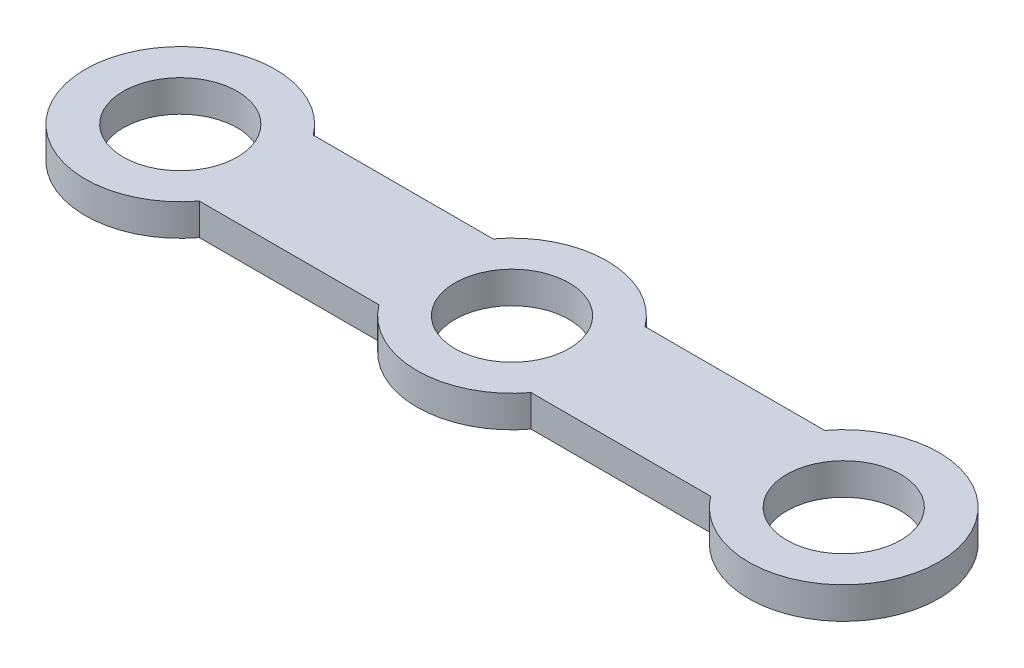
ISO-10303-21;
HEADER;
FILE_DESCRIPTION(('STEP AP214'),'2;1');
FILE_NAME('part.step','',(''),(''),'','','');
FILE_SCHEMA(('AUTOMOTIVE_DESIGN { 1 0 10303 214 1 1 1 1 }'));
ENDSEC;
DATA;
#1=APPLICATION_CONTEXT('core data for automotive mechanical design processes');
#2=APPLICATION_PROTOCOL_DEFINITION('international standard','automotive_design',2000,#1);
#3=PRODUCT_CONTEXT('',#1,'mechanical');
#4=PRODUCT('Part','Part','',(#3));
#5=PRODUCT_RELATED_PRODUCT_CATEGORY('part','',(#4));
#6=PRODUCT_DEFINITION_FORMATION('','',#4);
#7=PRODUCT_DEFINITION_CONTEXT('part definition',#1,'design');
#8=PRODUCT_DEFINITION('design','',#6,#7);
#9=PRODUCT_DEFINITION_SHAPE('','',#8);
#10=(LENGTH_UNIT() NAMED_UNIT(*) SI_UNIT(.MILLI.,.METRE.));
#11=(NAMED_UNIT(*) PLANE_ANGLE_UNIT() SI_UNIT($,.RADIAN.));
#12=(NAMED_UNIT(*) SI_UNIT($,.STERADIAN.) SOLID_ANGLE_UNIT());
#13=UNCERTAINTY_MEASURE_WITH_UNIT(LENGTH_MEASURE(1.E-05),#10,'distance_accuracy_value','');
#14=(GEOMETRIC_REPRESENTATION_CONTEXT(3) GLOBAL_UNCERTAINTY_ASSIGNED_CONTEXT((#13)) GLOBAL_UNIT_ASSIGNED_CONTEXT((#10,
#11,#12)) REPRESENTATION_CONTEXT('',''));
#15=CARTESIAN_POINT('',(0.,0.,0.));
#16=DIRECTION('',(0.,0.,1.));
#17=DIRECTION('',(1.,0.,0.));
#18=AXIS2_PLACEMENT_3D('',#15,#16,#17);
#19=CARTESIAN_POINT('',(1047.091,50.,-1.923474962349E-13));
#20=DIRECTION('',(0.,-1.,0.));
#21=DIRECTION('',(0.,0.,-1.));
#22=AXIS2_PLACEMENT_3D('',#19,#20,#21);
#23=CYLINDRICAL_SURFACE('',#22,150.);
#24=CARTESIAN_POINT('',(1047.091,0.,-1.923474962349E-13));
#25=DIRECTION('',(0.,1.,0.));
#26=DIRECTION('',(0.,0.,1.));
#27=AXIS2_PLACEMENT_3D('',#24,#25,#26);
#28=CIRCLE('',#27,150.);
#29=CARTESIAN_POINT('',(927.091,0.,89.9999999999998));
#30=VERTEX_POINT('',#29);
#31=CARTESIAN_POINT('',(927.091,0.,-90.0000000000002));
#32=VERTEX_POINT('',#31);
#33=EDGE_CURVE('E145',#30,#32,#28,.T.);
#34=ORIENTED_EDGE('',*,*,#33,.T.);
#35=DIRECTION('',(0.,-1.,0.));
#36=VECTOR('',#35,1.);
#37=CARTESIAN_POINT('',(927.091,50.,-90.0000000000002));
#38=LINE('',#37,#36);
#39=CARTESIAN_POINT('',(927.091,50.,-90.0000000000002));
#40=VERTEX_POINT('',#39);
#41=EDGE_CURVE('E11',#40,#32,#38,.T.);
#42=ORIENTED_EDGE('',*,*,#41,.F.);
#43=CARTESIAN_POINT('',(1047.091,50.,-1.923474962349E-13));
#44=DIRECTION('',(0.,1.,0.));
#45=DIRECTION('',(0.,0.,1.));
#46=AXIS2_PLACEMENT_3D('',#43,#44,#45);
#47=CIRCLE('',#46,150.);
#48=CARTESIAN_POINT('',(927.091,50.,89.9999999999998));
#49=VERTEX_POINT('',#48);
#50=EDGE_CURVE('E95',#49,#40,#47,.T.);
#51=ORIENTED_EDGE('',*,*,#50,.F.);
#52=DIRECTION('',(0.,-1.,0.));
#53=VECTOR('',#52,1.);
#54=CARTESIAN_POINT('',(927.091,50.,89.9999999999998));
#55=LINE('',#54,#53);
#56=EDGE_CURVE('E144',#49,#30,#55,.T.);
#57=ORIENTED_EDGE('',*,*,#56,.T.);
#58=EDGE_LOOP('',(#34,#42,#51,#57));
#59=FACE_BOUND('',#58,.T.);
#60=ADVANCED_FACE('F39',(#59),#23,.T.);
#61=CARTESIAN_POINT('',(0.,50.,-90.));
#62=DIRECTION('',(0.,0.,-1.));
#63=DIRECTION('',(-1.,0.,0.));
#64=AXIS2_PLACEMENT_3D('',#61,#62,#63);
#65=PLANE('',#64);
#66=DIRECTION('',(1.,0.,0.));
#67=VECTOR('',#66,1.);
#68=CARTESIAN_POINT('',(0.,0.,-90.));
#69=LINE('',#68,#67);
#70=CARTESIAN_POINT('',(643.5455,0.,-90.0000000000001));
#71=VERTEX_POINT('',#70);
#72=EDGE_CURVE('E148',#71,#32,#69,.T.);
#73=ORIENTED_EDGE('',*,*,#72,.F.);
#74=DIRECTION('',(0.,-1.,0.));
#75=VECTOR('',#74,1.);
#76=CARTESIAN_POINT('',(643.5455,50.,-90.0000000000001));
#77=LINE('',#76,#75);
#78=CARTESIAN_POINT('',(643.5455,50.,-90.0000000000001));
#79=VERTEX_POINT('',#78);
#80=EDGE_CURVE('E47',#79,#71,#77,.T.);
#81=ORIENTED_EDGE('',*,*,#80,.F.);
#82=DIRECTION('',(1.,0.,0.));
#83=VECTOR('',#82,1.);
#84=CARTESIAN_POINT('',(0.,50.,-90.));
#85=LINE('',#84,#83);
#86=EDGE_CURVE('E193',#79,#40,#85,.T.);
#87=ORIENTED_EDGE('',*,*,#86,.T.);
#88=ORIENTED_EDGE('',*,*,#41,.T.);
#89=EDGE_LOOP('',(#73,#81,#87,#88));
#90=FACE_BOUND('',#89,.T.);
#91=ADVANCED_FACE('F192',(#90),#65,.T.);
#92=CARTESIAN_POINT('',(523.5455,50.,0.));
#93=DIRECTION('',(0.,-1.,0.));
#94=DIRECTION('',(0.,0.,-1.));
#95=AXIS2_PLACEMENT_3D('',#92,#93,#94);
#96=CYLINDRICAL_SURFACE('',#95,150.);
#97=CARTESIAN_POINT('',(523.5455,0.,0.));
#98=DIRECTION('',(0.,1.,0.));
#99=DIRECTION('',(0.,0.,1.));
#100=AXIS2_PLACEMENT_3D('',#97,#98,#99);
#101=CIRCLE('',#100,150.);
#102=CARTESIAN_POINT('',(403.5455,0.,-90.));
#103=VERTEX_POINT('',#102);
#104=EDGE_CURVE('E151',#71,#103,#101,.T.);
#105=ORIENTED_EDGE('',*,*,#104,.T.);
#106=DIRECTION('',(0.,-1.,0.));
#107=VECTOR('',#106,1.);
#108=CARTESIAN_POINT('',(403.5455,50.,-90.));
#109=LINE('',#108,#107);
#110=CARTESIAN_POINT('',(403.5455,50.,-90.));
#111=VERTEX_POINT('',#110);
#112=EDGE_CURVE('E176',#111,#103,#109,.T.);
#113=ORIENTED_EDGE('',*,*,#112,.F.);
#114=CARTESIAN_POINT('',(523.5455,50.,0.));
#115=DIRECTION('',(0.,1.,0.));
#116=DIRECTION('',(0.,0.,1.));
#117=AXIS2_PLACEMENT_3D('',#114,#115,#116);
#118=CIRCLE('',#117,150.);
#119=EDGE_CURVE('E182',#79,#111,#118,.T.);
#120=ORIENTED_EDGE('',*,*,#119,.F.);
#121=ORIENTED_EDGE('',*,*,#80,.T.);
#122=EDGE_LOOP('',(#105,#113,#120,#121));
#123=FACE_BOUND('',#122,.T.);
#124=ADVANCED_FACE('F180',(#123),#96,.T.);
#125=CARTESIAN_POINT('',(0.,50.,-90.));
#126=DIRECTION('',(0.,0.,-1.));
#127=DIRECTION('',(-1.,0.,0.));
#128=AXIS2_PLACEMENT_3D('',#125,#126,#127);
#129=PLANE('',#128);
#130=DIRECTION('',(1.,0.,0.));
#131=VECTOR('',#130,1.);
#132=CARTESIAN_POINT('',(0.,0.,-90.));
#133=LINE('',#132,#131);
#134=CARTESIAN_POINT('',(120.,0.,-90.));
#135=VERTEX_POINT('',#134);
#136=EDGE_CURVE('E154',#135,#103,#133,.T.);
#137=ORIENTED_EDGE('',*,*,#136,.F.);
#138=DIRECTION('',(0.,-1.,0.));
#139=VECTOR('',#138,1.);
#140=CARTESIAN_POINT('',(120.,50.,-90.));
#141=LINE('',#140,#139);
#142=CARTESIAN_POINT('',(120.,50.,-90.));
#143=VERTEX_POINT('',#142);
#144=EDGE_CURVE('E174',#143,#135,#141,.T.);
#145=ORIENTED_EDGE('',*,*,#144,.F.);
#146=DIRECTION('',(1.,0.,0.));
#147=VECTOR('',#146,1.);
#148=CARTESIAN_POINT('',(0.,50.,-90.));
#149=LINE('',#148,#147);
#150=EDGE_CURVE('E199',#143,#111,#149,.T.);
#151=ORIENTED_EDGE('',*,*,#150,.T.);
#152=ORIENTED_EDGE('',*,*,#112,.T.);
#153=EDGE_LOOP('',(#137,#145,#151,#152));
#154=FACE_BOUND('',#153,.T.);
#155=ADVANCED_FACE('F197',(#154),#129,.T.);
#156=CARTESIAN_POINT('',(0.,50.,0.));
#157=DIRECTION('',(0.,-1.,0.));
#158=DIRECTION('',(0.,0.,-1.));
#159=AXIS2_PLACEMENT_3D('',#156,#157,#158);
#160=CYLINDRICAL_SURFACE('',#159,150.);
#161=CARTESIAN_POINT('',(0.,0.,0.));
#162=DIRECTION('',(0.,1.,0.));
#163=DIRECTION('',(0.,0.,1.));
#164=AXIS2_PLACEMENT_3D('',#161,#162,#163);
#165=CIRCLE('',#164,150.);
#166=CARTESIAN_POINT('',(120.,0.,90.));
#167=VERTEX_POINT('',#166);
#168=EDGE_CURVE('E157',#135,#167,#165,.T.);
#169=ORIENTED_EDGE('',*,*,#168,.T.);
#170=DIRECTION('',(0.,-1.,0.));
#171=VECTOR('',#170,1.);
#172=CARTESIAN_POINT('',(120.,50.,90.));
#173=LINE('',#172,#171);
#174=CARTESIAN_POINT('',(120.,50.,90.));
#175=VERTEX_POINT('',#174);
#176=EDGE_CURVE('E127',#175,#167,#173,.T.);
#177=ORIENTED_EDGE('',*,*,#176,.F.);
#178=CARTESIAN_POINT('',(0.,50.,0.));
#179=DIRECTION('',(0.,1.,0.));
#180=DIRECTION('',(0.,0.,1.));
#181=AXIS2_PLACEMENT_3D('',#178,#179,#180);
#182=CIRCLE('',#181,150.);
#183=EDGE_CURVE('E118',#143,#175,#182,.T.);
#184=ORIENTED_EDGE('',*,*,#183,.F.);
#185=ORIENTED_EDGE('',*,*,#144,.T.);
#186=EDGE_LOOP('',(#169,#177,#184,#185));
#187=FACE_BOUND('',#186,.T.);
#188=ADVANCED_FACE('F204',(#187),#160,.T.);
#189=CARTESIAN_POINT('',(0.,50.,90.));
#190=DIRECTION('',(0.,0.,-1.));
#191=DIRECTION('',(-1.,0.,0.));
#192=AXIS2_PLACEMENT_3D('',#189,#190,#191);
#193=PLANE('',#192);
#194=DIRECTION('',(1.,0.,0.));
#195=VECTOR('',#194,1.);
#196=CARTESIAN_POINT('',(0.,0.,90.));
#197=LINE('',#196,#195);
#198=CARTESIAN_POINT('',(403.5455,0.,90.));
#199=VERTEX_POINT('',#198);
#200=EDGE_CURVE('E126',#167,#199,#197,.T.);
#201=ORIENTED_EDGE('',*,*,#200,.T.);
#202=DIRECTION('',(0.,-1.,0.));
#203=VECTOR('',#202,1.);
#204=CARTESIAN_POINT('',(403.5455,50.,90.));
#205=LINE('',#204,#203);
#206=CARTESIAN_POINT('',(403.5455,50.,90.));
#207=VERTEX_POINT('',#206);
#208=EDGE_CURVE('E123',#207,#199,#205,.T.);
#209=ORIENTED_EDGE('',*,*,#208,.F.);
#210=DIRECTION('',(1.,0.,0.));
#211=VECTOR('',#210,1.);
#212=CARTESIAN_POINT('',(0.,50.,90.));
#213=LINE('',#212,#211);
#214=EDGE_CURVE('E110',#175,#207,#213,.T.);
#215=ORIENTED_EDGE('',*,*,#214,.F.);
#216=ORIENTED_EDGE('',*,*,#176,.T.);
#217=EDGE_LOOP('',(#201,#209,#215,#216));
#218=FACE_BOUND('',#217,.T.);
#219=ADVANCED_FACE('F124',(#218),#193,.F.);
#220=CARTESIAN_POINT('',(523.5455,50.,0.));
#221=DIRECTION('',(0.,-1.,0.));
#222=DIRECTION('',(0.,0.,-1.));
#223=AXIS2_PLACEMENT_3D('',#220,#221,#222);
#224=CYLINDRICAL_SURFACE('',#223,150.);
#225=CARTESIAN_POINT('',(523.5455,0.,0.));
#226=DIRECTION('',(0.,1.,0.));
#227=DIRECTION('',(0.,0.,1.));
#228=AXIS2_PLACEMENT_3D('',#225,#226,#227);
#229=CIRCLE('',#228,150.);
#230=CARTESIAN_POINT('',(643.5455,0.,89.9999999999999));
#231=VERTEX_POINT('',#230);
#232=EDGE_CURVE('E83',#199,#231,#229,.T.);
#233=ORIENTED_EDGE('',*,*,#232,.T.);
#234=DIRECTION('',(0.,-1.,0.));
#235=VECTOR('',#234,1.);
#236=CARTESIAN_POINT('',(643.5455,50.,89.9999999999999));
#237=LINE('',#236,#235);
#238=CARTESIAN_POINT('',(643.5455,50.,89.9999999999999));
#239=VERTEX_POINT('',#238);
#240=EDGE_CURVE('E128',#239,#231,#237,.T.);
#241=ORIENTED_EDGE('',*,*,#240,.F.);
#242=CARTESIAN_POINT('',(523.5455,50.,0.));
#243=DIRECTION('',(0.,1.,0.));
#244=DIRECTION('',(0.,0.,1.));
#245=AXIS2_PLACEMENT_3D('',#242,#243,#244);
#246=CIRCLE('',#245,150.);
#247=EDGE_CURVE('E115',#207,#239,#246,.T.);
#248=ORIENTED_EDGE('',*,*,#247,.F.);
#249=ORIENTED_EDGE('',*,*,#208,.T.);
#250=EDGE_LOOP('',(#233,#241,#248,#249));
#251=FACE_BOUND('',#250,.T.);
#252=ADVANCED_FACE('F130',(#251),#224,.T.);
#253=CARTESIAN_POINT('',(0.,50.,0.));
#254=DIRECTION('',(0.,-1.,0.));
#255=DIRECTION('',(0.,0.,-1.));
#256=AXIS2_PLACEMENT_3D('',#253,#254,#255);
#257=CYLINDRICAL_SURFACE('',#256,90.);
#258=CARTESIAN_POINT('',(0.,50.,0.));
#259=DIRECTION('',(0.,1.,0.));
#260=DIRECTION('',(0.,0.,1.));
#261=AXIS2_PLACEMENT_3D('',#258,#259,#260);
#262=CIRCLE('',#261,90.);
#263=CARTESIAN_POINT('',(0.,50.,90.));
#264=VERTEX_POINT('',#263);
#265=EDGE_CURVE('E138',#264,#264,#262,.T.);
#266=ORIENTED_EDGE('',*,*,#265,.T.);
#267=EDGE_LOOP('',(#266));
#268=FACE_BOUND('',#267,.T.);
#269=CARTESIAN_POINT('',(0.,0.,0.));
#270=DIRECTION('',(0.,1.,0.));
#271=DIRECTION('',(0.,0.,1.));
#272=AXIS2_PLACEMENT_3D('',#269,#270,#271);
#273=CIRCLE('',#272,90.);
#274=CARTESIAN_POINT('',(0.,0.,90.));
#275=VERTEX_POINT('',#274);
#276=EDGE_CURVE('E165',#275,#275,#273,.T.);
#277=ORIENTED_EDGE('',*,*,#276,.F.);
#278=EDGE_LOOP('',(#277));
#279=FACE_BOUND('',#278,.T.);
#280=ADVANCED_FACE('F249',(#268,#279),#257,.F.);
#281=CARTESIAN_POINT('',(523.5455,50.,0.));
#282=DIRECTION('',(0.,-1.,0.));
#283=DIRECTION('',(0.,0.,-1.));
#284=AXIS2_PLACEMENT_3D('',#281,#282,#283);
#285=CYLINDRICAL_SURFACE('',#284,90.0000000000002);
#286=CARTESIAN_POINT('',(523.5455,50.,0.));
#287=DIRECTION('',(0.,1.,0.));
#288=DIRECTION('',(0.,0.,1.));
#289=AXIS2_PLACEMENT_3D('',#286,#287,#288);
#290=CIRCLE('',#289,90.0000000000002);
#291=CARTESIAN_POINT('',(523.5455,50.,90.0000000000002));
#292=VERTEX_POINT('',#291);
#293=EDGE_CURVE('E132',#292,#292,#290,.T.);
#294=ORIENTED_EDGE('',*,*,#293,.T.);
#295=EDGE_LOOP('',(#294));
#296=FACE_BOUND('',#295,.T.);
#297=CARTESIAN_POINT('',(523.5455,0.,0.));
#298=DIRECTION('',(0.,1.,0.));
#299=DIRECTION('',(0.,0.,1.));
#300=AXIS2_PLACEMENT_3D('',#297,#298,#299);
#301=CIRCLE('',#300,90.0000000000002);
#302=CARTESIAN_POINT('',(523.5455,0.,90.0000000000002));
#303=VERTEX_POINT('',#302);
#304=EDGE_CURVE('E162',#303,#303,#301,.T.);
#305=ORIENTED_EDGE('',*,*,#304,.F.);
#306=EDGE_LOOP('',(#305));
#307=FACE_BOUND('',#306,.T.);
#308=ADVANCED_FACE('F259',(#296,#307),#285,.F.);
#309=CARTESIAN_POINT('',(0.,50.,90.));
#310=DIRECTION('',(0.,0.,-1.));
#311=DIRECTION('',(-1.,0.,0.));
#312=AXIS2_PLACEMENT_3D('',#309,#310,#311);
#313=PLANE('',#312);
#314=DIRECTION('',(1.,0.,0.));
#315=VECTOR('',#314,1.);
#316=CARTESIAN_POINT('',(0.,0.,90.));
#317=LINE('',#316,#315);
#318=EDGE_CURVE('E89',#231,#30,#317,.T.);
#319=ORIENTED_EDGE('',*,*,#318,.T.);
#320=ORIENTED_EDGE('',*,*,#56,.F.);
#321=DIRECTION('',(1.,0.,0.));
#322=VECTOR('',#321,1.);
#323=CARTESIAN_POINT('',(0.,50.,90.));
#324=LINE('',#323,#322);
#325=EDGE_CURVE('E55',#239,#49,#324,.T.);
#326=ORIENTED_EDGE('',*,*,#325,.F.);
#327=ORIENTED_EDGE('',*,*,#240,.T.);
#328=EDGE_LOOP('',(#319,#320,#326,#327));
#329=FACE_BOUND('',#328,.T.);
#330=ADVANCED_FACE('F270',(#329),#313,.F.);
#331=CARTESIAN_POINT('',(1047.091,50.,-1.923474962349E-13));
#332=DIRECTION('',(0.,-1.,0.));
#333=DIRECTION('',(0.,0.,-1.));
#334=AXIS2_PLACEMENT_3D('',#331,#332,#333);
#335=CYLINDRICAL_SURFACE('',#334,89.9999999999999);
#336=CARTESIAN_POINT('',(1047.091,50.,-1.923474962349E-13));
#337=DIRECTION('',(0.,1.,0.));
#338=DIRECTION('',(0.,0.,1.));
#339=AXIS2_PLACEMENT_3D('',#336,#337,#338);
#340=CIRCLE('',#339,89.9999999999999);
#341=CARTESIAN_POINT('',(1047.091,50.,89.9999999999997));
#342=VERTEX_POINT('',#341);
#343=EDGE_CURVE('E141',#342,#342,#340,.T.);
#344=ORIENTED_EDGE('',*,*,#343,.T.);
#345=EDGE_LOOP('',(#344));
#346=FACE_BOUND('',#345,.T.);
#347=CARTESIAN_POINT('',(1047.091,0.,-1.923474962349E-13));
#348=DIRECTION('',(0.,1.,0.));
#349=DIRECTION('',(0.,0.,1.));
#350=AXIS2_PLACEMENT_3D('',#347,#348,#349);
#351=CIRCLE('',#350,89.9999999999999);
#352=CARTESIAN_POINT('',(1047.091,0.,89.9999999999997));
#353=VERTEX_POINT('',#352);
#354=EDGE_CURVE('E168',#353,#353,#351,.T.);
#355=ORIENTED_EDGE('',*,*,#354,.F.);
#356=EDGE_LOOP('',(#355));
#357=FACE_BOUND('',#356,.T.);
#358=ADVANCED_FACE('F281',(#346,#357),#335,.F.);
#359=CARTESIAN_POINT('',(0.,50.,0.));
#360=DIRECTION('',(0.,1.,0.));
#361=DIRECTION('',(0.,0.,1.));
#362=AXIS2_PLACEMENT_3D('',#359,#360,#361);
#363=PLANE('',#362);
#364=ORIENTED_EDGE('',*,*,#50,.T.);
#365=ORIENTED_EDGE('',*,*,#86,.F.);
#366=ORIENTED_EDGE('',*,*,#119,.T.);
#367=ORIENTED_EDGE('',*,*,#150,.F.);
#368=ORIENTED_EDGE('',*,*,#183,.T.);
#369=ORIENTED_EDGE('',*,*,#214,.T.);
#370=ORIENTED_EDGE('',*,*,#247,.T.);
#371=ORIENTED_EDGE('',*,*,#325,.T.);
#372=EDGE_LOOP('',(#364,#365,#366,#367,#368,#369,#370,#371));
#373=FACE_BOUND('',#372,.T.);
#374=ORIENTED_EDGE('',*,*,#293,.F.);
#375=EDGE_LOOP('',(#374));
#376=FACE_BOUND('',#375,.T.);
#377=ORIENTED_EDGE('',*,*,#265,.F.);
#378=EDGE_LOOP('',(#377));
#379=FACE_BOUND('',#378,.T.);
#380=ORIENTED_EDGE('',*,*,#343,.F.);
#381=EDGE_LOOP('',(#380));
#382=FACE_BOUND('',#381,.T.);
#383=ADVANCED_FACE('F112',(#373,#376,#379,#382),#363,.T.);
#384=CARTESIAN_POINT('',(0.,0.,0.));
#385=DIRECTION('',(0.,1.,0.));
#386=DIRECTION('',(0.,0.,1.));
#387=AXIS2_PLACEMENT_3D('',#384,#385,#386);
#388=PLANE('',#387);
#389=ORIENTED_EDGE('',*,*,#33,.F.);
#390=ORIENTED_EDGE('',*,*,#318,.F.);
#391=ORIENTED_EDGE('',*,*,#232,.F.);
#392=ORIENTED_EDGE('',*,*,#200,.F.);
#393=ORIENTED_EDGE('',*,*,#168,.F.);
#394=ORIENTED_EDGE('',*,*,#136,.T.);
#395=ORIENTED_EDGE('',*,*,#104,.F.);
#396=ORIENTED_EDGE('',*,*,#72,.T.);
#397=EDGE_LOOP('',(#389,#390,#391,#392,#393,#394,#395,#396));
#398=FACE_BOUND('',#397,.T.);
#399=ORIENTED_EDGE('',*,*,#304,.T.);
#400=EDGE_LOOP('',(#399));
#401=FACE_BOUND('',#400,.T.);
#402=ORIENTED_EDGE('',*,*,#276,.T.);
#403=EDGE_LOOP('',(#402));
#404=FACE_BOUND('',#403,.T.);
#405=ORIENTED_EDGE('',*,*,#354,.T.);
#406=EDGE_LOOP('',(#405));
#407=FACE_BOUND('',#406,.T.);
#408=ADVANCED_FACE('F188',(#398,#401,#404,#407),#388,.F.);
#409=CLOSED_SHELL('',(#60,#91,#124,#155,#188,#219,#252,#280,#308,#330,#358,#383,#408));
#410=MANIFOLD_SOLID_BREP('B2',#409);
#411=ADVANCED_BREP_SHAPE_REPRESENTATION('',(#18,#410),#14);
#412=SHAPE_DEFINITION_REPRESENTATION(#9,#411);
ENDSEC;
END-ISO-10303-21;
